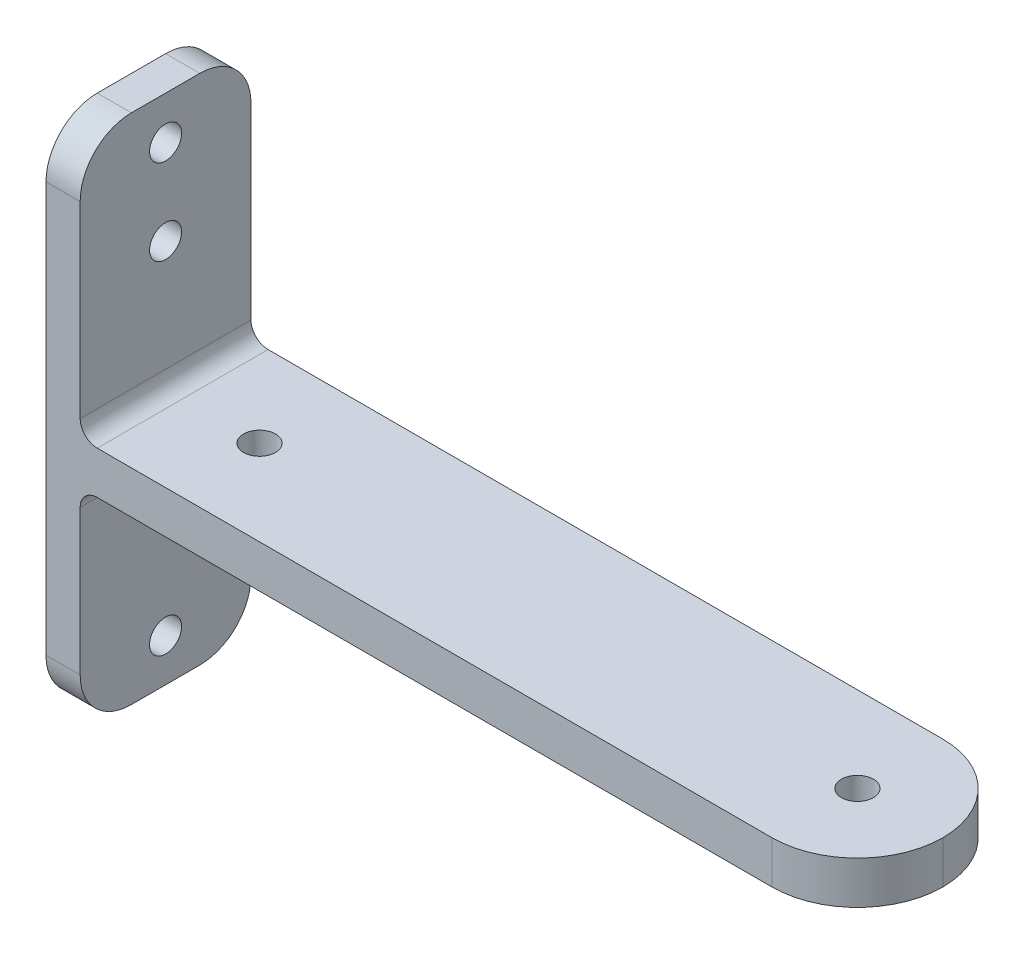
ISO-10303-21;
HEADER;
FILE_DESCRIPTION(('STEP AP214'),'2;1');
FILE_NAME('part.step','',(''),(''),'','','');
FILE_SCHEMA(('AUTOMOTIVE_DESIGN { 1 0 10303 214 1 1 1 1 }'));
ENDSEC;
DATA;
#1=APPLICATION_CONTEXT('core data for automotive mechanical design processes');
#2=APPLICATION_PROTOCOL_DEFINITION('international standard','automotive_design',2000,#1);
#3=PRODUCT_CONTEXT('',#1,'mechanical');
#4=PRODUCT('Part','Part','',(#3));
#5=PRODUCT_RELATED_PRODUCT_CATEGORY('part','',(#4));
#6=PRODUCT_DEFINITION_FORMATION('','',#4);
#7=PRODUCT_DEFINITION_CONTEXT('part definition',#1,'design');
#8=PRODUCT_DEFINITION('design','',#6,#7);
#9=PRODUCT_DEFINITION_SHAPE('','',#8);
#10=(LENGTH_UNIT() NAMED_UNIT(*) SI_UNIT(.MILLI.,.METRE.));
#11=(NAMED_UNIT(*) PLANE_ANGLE_UNIT() SI_UNIT($,.RADIAN.));
#12=(NAMED_UNIT(*) SI_UNIT($,.STERADIAN.) SOLID_ANGLE_UNIT());
#13=UNCERTAINTY_MEASURE_WITH_UNIT(LENGTH_MEASURE(1.E-05),#10,'distance_accuracy_value','');
#14=(GEOMETRIC_REPRESENTATION_CONTEXT(3) GLOBAL_UNCERTAINTY_ASSIGNED_CONTEXT((#13)) GLOBAL_UNIT_ASSIGNED_CONTEXT((#10,
#11,#12)) REPRESENTATION_CONTEXT('',''));
#15=CARTESIAN_POINT('',(0.,0.,0.));
#16=DIRECTION('',(0.,0.,1.));
#17=DIRECTION('',(1.,0.,0.));
#18=AXIS2_PLACEMENT_3D('',#15,#16,#17);
#19=CARTESIAN_POINT('',(0.,6.35,0.));
#20=DIRECTION('',(0.,1.,0.));
#21=DIRECTION('',(0.,0.,1.));
#22=AXIS2_PLACEMENT_3D('',#19,#20,#21);
#23=PLANE('',#22);
#24=DIRECTION('',(1.,0.,0.));
#25=VECTOR('',#24,1.);
#26=CARTESIAN_POINT('',(-60.325,6.35,12.7));
#27=LINE('',#26,#25);
#28=CARTESIAN_POINT('',(-52.705,6.35,12.7));
#29=VERTEX_POINT('',#28);
#30=CARTESIAN_POINT('',(47.6249999999999,6.35,12.7));
#31=VERTEX_POINT('',#30);
#32=EDGE_CURVE('E234',#29,#31,#27,.T.);
#33=ORIENTED_EDGE('',*,*,#32,.T.);
#34=CARTESIAN_POINT('',(47.625,6.35,0.));
#35=DIRECTION('',(0.,1.,0.));
#36=DIRECTION('',(0.,0.,1.));
#37=AXIS2_PLACEMENT_3D('',#34,#35,#36);
#38=CIRCLE('',#37,12.7);
#39=CARTESIAN_POINT('',(60.325,6.35,0.));
#40=VERTEX_POINT('',#39);
#41=EDGE_CURVE('E46',#31,#40,#38,.T.);
#42=ORIENTED_EDGE('',*,*,#41,.T.);
#43=CARTESIAN_POINT('',(47.625,6.35,0.));
#44=DIRECTION('',(0.,1.,0.));
#45=DIRECTION('',(0.,0.,1.));
#46=AXIS2_PLACEMENT_3D('',#43,#44,#45);
#47=CIRCLE('',#46,12.7);
#48=CARTESIAN_POINT('',(47.6249999999999,6.35,-12.7));
#49=VERTEX_POINT('',#48);
#50=EDGE_CURVE('E56',#40,#49,#47,.T.);
#51=ORIENTED_EDGE('',*,*,#50,.T.);
#52=DIRECTION('',(-1.,0.,0.));
#53=VECTOR('',#52,1.);
#54=CARTESIAN_POINT('',(-60.325,6.35,-12.7));
#55=LINE('',#54,#53);
#56=CARTESIAN_POINT('',(-52.705,6.35,-12.7));
#57=VERTEX_POINT('',#56);
#58=EDGE_CURVE('E165',#49,#57,#55,.T.);
#59=ORIENTED_EDGE('',*,*,#58,.T.);
#60=DIRECTION('',(0.,0.,-1.));
#61=VECTOR('',#60,1.);
#62=CARTESIAN_POINT('',(-52.705,6.35,12.7));
#63=LINE('',#62,#61);
#64=EDGE_CURVE('E185',#57,#29,#63,.F.);
#65=ORIENTED_EDGE('',*,*,#64,.T.);
#66=EDGE_LOOP('',(#33,#42,#51,#59,#65));
#67=FACE_BOUND('',#66,.T.);
#68=CARTESIAN_POINT('',(-41.275,6.35,0.));
#69=DIRECTION('',(0.,1.,0.));
#70=DIRECTION('',(0.,0.,1.));
#71=AXIS2_PLACEMENT_3D('',#68,#69,#70);
#72=CIRCLE('',#71,2.38125);
#73=CARTESIAN_POINT('',(-41.275,6.35,2.38125));
#74=VERTEX_POINT('',#73);
#75=EDGE_CURVE('E278',#74,#74,#72,.T.);
#76=ORIENTED_EDGE('',*,*,#75,.F.);
#77=EDGE_LOOP('',(#76));
#78=FACE_BOUND('',#77,.T.);
#79=CARTESIAN_POINT('',(47.625,6.35,0.));
#80=DIRECTION('',(0.,1.,0.));
#81=DIRECTION('',(0.,0.,1.));
#82=AXIS2_PLACEMENT_3D('',#79,#80,#81);
#83=CIRCLE('',#82,2.38125);
#84=CARTESIAN_POINT('',(47.625,6.35,2.38125));
#85=VERTEX_POINT('',#84);
#86=EDGE_CURVE('E245',#85,#85,#83,.T.);
#87=ORIENTED_EDGE('',*,*,#86,.F.);
#88=EDGE_LOOP('',(#87));
#89=FACE_BOUND('',#88,.T.);
#90=ADVANCED_FACE('F37',(#67,#78,#89),#23,.T.);
#91=CARTESIAN_POINT('',(0.,0.,0.));
#92=DIRECTION('',(0.,1.,0.));
#93=DIRECTION('',(0.,0.,1.));
#94=AXIS2_PLACEMENT_3D('',#91,#92,#93);
#95=PLANE('',#94);
#96=CARTESIAN_POINT('',(-41.275,0.,0.));
#97=DIRECTION('',(0.,1.,0.));
#98=DIRECTION('',(0.,0.,1.));
#99=AXIS2_PLACEMENT_3D('',#96,#97,#98);
#100=CIRCLE('',#99,2.38125);
#101=CARTESIAN_POINT('',(-41.275,0.,2.38125));
#102=VERTEX_POINT('',#101);
#103=EDGE_CURVE('E281',#102,#102,#100,.T.);
#104=ORIENTED_EDGE('',*,*,#103,.T.);
#105=EDGE_LOOP('',(#104));
#106=FACE_BOUND('',#105,.T.);
#107=CARTESIAN_POINT('',(47.625,0.,0.));
#108=DIRECTION('',(0.,1.,0.));
#109=DIRECTION('',(0.,0.,1.));
#110=AXIS2_PLACEMENT_3D('',#107,#108,#109);
#111=CIRCLE('',#110,12.7);
#112=CARTESIAN_POINT('',(47.6249999999999,0.,-12.7));
#113=VERTEX_POINT('',#112);
#114=CARTESIAN_POINT('',(60.325,0.,0.));
#115=VERTEX_POINT('',#114);
#116=EDGE_CURVE('E227',#113,#115,#111,.F.);
#117=ORIENTED_EDGE('',*,*,#116,.T.);
#118=CARTESIAN_POINT('',(47.625,0.,0.));
#119=DIRECTION('',(0.,1.,0.));
#120=DIRECTION('',(0.,0.,1.));
#121=AXIS2_PLACEMENT_3D('',#118,#119,#120);
#122=CIRCLE('',#121,12.7);
#123=CARTESIAN_POINT('',(47.6249999999999,0.,12.7));
#124=VERTEX_POINT('',#123);
#125=EDGE_CURVE('E164',#115,#124,#122,.F.);
#126=ORIENTED_EDGE('',*,*,#125,.T.);
#127=DIRECTION('',(1.,0.,0.));
#128=VECTOR('',#127,1.);
#129=CARTESIAN_POINT('',(-60.325,0.,12.7));
#130=LINE('',#129,#128);
#131=CARTESIAN_POINT('',(-52.705,0.,12.7));
#132=VERTEX_POINT('',#131);
#133=EDGE_CURVE('E145',#132,#124,#130,.T.);
#134=ORIENTED_EDGE('',*,*,#133,.F.);
#135=DIRECTION('',(0.,0.,-1.));
#136=VECTOR('',#135,1.);
#137=CARTESIAN_POINT('',(-52.705,0.,0.));
#138=LINE('',#137,#136);
#139=CARTESIAN_POINT('',(-52.705,0.,-12.7));
#140=VERTEX_POINT('',#139);
#141=EDGE_CURVE('E162',#132,#140,#138,.T.);
#142=ORIENTED_EDGE('',*,*,#141,.T.);
#143=DIRECTION('',(-1.,0.,0.));
#144=VECTOR('',#143,1.);
#145=CARTESIAN_POINT('',(-60.325,0.,-12.7));
#146=LINE('',#145,#144);
#147=EDGE_CURVE('E166',#113,#140,#146,.T.);
#148=ORIENTED_EDGE('',*,*,#147,.F.);
#149=EDGE_LOOP('',(#117,#126,#134,#142,#148));
#150=FACE_BOUND('',#149,.T.);
#151=CARTESIAN_POINT('',(47.625,0.,0.));
#152=DIRECTION('',(0.,1.,0.));
#153=DIRECTION('',(0.,0.,1.));
#154=AXIS2_PLACEMENT_3D('',#151,#152,#153);
#155=CIRCLE('',#154,2.38125);
#156=CARTESIAN_POINT('',(47.625,0.,2.38125));
#157=VERTEX_POINT('',#156);
#158=EDGE_CURVE('E284',#157,#157,#155,.T.);
#159=ORIENTED_EDGE('',*,*,#158,.T.);
#160=EDGE_LOOP('',(#159));
#161=FACE_BOUND('',#160,.T.);
#162=ADVANCED_FACE('F159',(#106,#150,#161),#95,.F.);
#163=CARTESIAN_POINT('',(-60.325,6.35,-12.7));
#164=DIRECTION('',(0.,0.,1.));
#165=DIRECTION('',(1.,0.,0.));
#166=AXIS2_PLACEMENT_3D('',#163,#164,#165);
#167=PLANE('',#166);
#168=ORIENTED_EDGE('',*,*,#58,.F.);
#169=DIRECTION('',(0.,-1.,0.));
#170=VECTOR('',#169,1.);
#171=CARTESIAN_POINT('',(47.625,6.35,-12.7));
#172=LINE('',#171,#170);
#173=EDGE_CURVE('E11',#49,#113,#172,.T.);
#174=ORIENTED_EDGE('',*,*,#173,.T.);
#175=ORIENTED_EDGE('',*,*,#147,.T.);
#176=CARTESIAN_POINT('',(-52.705,-2.54,-12.7));
#177=DIRECTION('',(0.,0.,1.));
#178=DIRECTION('',(1.,0.,0.));
#179=AXIS2_PLACEMENT_3D('',#176,#177,#178);
#180=CIRCLE('',#179,2.54);
#181=CARTESIAN_POINT('',(-55.245,-2.54000000000001,-12.7));
#182=VERTEX_POINT('',#181);
#183=EDGE_CURVE('E155',#140,#182,#180,.T.);
#184=ORIENTED_EDGE('',*,*,#183,.T.);
#185=DIRECTION('',(0.,1.,0.));
#186=VECTOR('',#185,1.);
#187=CARTESIAN_POINT('',(-55.245,-31.75,-12.7));
#188=LINE('',#187,#186);
#189=CARTESIAN_POINT('',(-55.245,-24.13,-12.7));
#190=VERTEX_POINT('',#189);
#191=EDGE_CURVE('E276',#190,#182,#188,.T.);
#192=ORIENTED_EDGE('',*,*,#191,.F.);
#193=DIRECTION('',(-1.,0.,0.));
#194=VECTOR('',#193,1.);
#195=CARTESIAN_POINT('',(-60.325,-24.13,-12.7));
#196=LINE('',#195,#194);
#197=CARTESIAN_POINT('',(-60.325,-24.13,-12.7));
#198=VERTEX_POINT('',#197);
#199=EDGE_CURVE('E214',#190,#198,#196,.T.);
#200=ORIENTED_EDGE('',*,*,#199,.T.);
#201=DIRECTION('',(0.,-1.,0.));
#202=VECTOR('',#201,1.);
#203=CARTESIAN_POINT('',(-60.325,6.35,-12.7));
#204=LINE('',#203,#202);
#205=CARTESIAN_POINT('',(-60.325,36.83,-12.7));
#206=VERTEX_POINT('',#205);
#207=EDGE_CURVE('E172',#206,#198,#204,.T.);
#208=ORIENTED_EDGE('',*,*,#207,.F.);
#209=DIRECTION('',(-1.,0.,0.));
#210=VECTOR('',#209,1.);
#211=CARTESIAN_POINT('',(-55.245,36.83,-12.7));
#212=LINE('',#211,#210);
#213=CARTESIAN_POINT('',(-55.245,36.83,-12.7));
#214=VERTEX_POINT('',#213);
#215=EDGE_CURVE('E212',#206,#214,#212,.F.);
#216=ORIENTED_EDGE('',*,*,#215,.T.);
#217=CARTESIAN_POINT('',(-55.245,8.88999999999999,-12.7));
#218=VERTEX_POINT('',#217);
#219=EDGE_CURVE('E279',#218,#214,#188,.T.);
#220=ORIENTED_EDGE('',*,*,#219,.F.);
#221=CARTESIAN_POINT('',(-52.705,8.89,-12.7));
#222=DIRECTION('',(0.,0.,1.));
#223=DIRECTION('',(1.,0.,0.));
#224=AXIS2_PLACEMENT_3D('',#221,#222,#223);
#225=CIRCLE('',#224,2.54);
#226=EDGE_CURVE('E154',#218,#57,#225,.T.);
#227=ORIENTED_EDGE('',*,*,#226,.T.);
#228=EDGE_LOOP('',(#168,#174,#175,#184,#192,#200,#208,#216,#220,#227));
#229=FACE_BOUND('',#228,.T.);
#230=ADVANCED_FACE('F310',(#229),#167,.F.);
#231=CARTESIAN_POINT('',(-60.325,6.35,-12.7));
#232=DIRECTION('',(1.,0.,0.));
#233=DIRECTION('',(0.,0.,-1.));
#234=AXIS2_PLACEMENT_3D('',#231,#232,#233);
#235=PLANE('',#234);
#236=CARTESIAN_POINT('',(-60.325,38.1,0.));
#237=DIRECTION('',(-1.,0.,0.));
#238=DIRECTION('',(0.,0.,1.));
#239=AXIS2_PLACEMENT_3D('',#236,#237,#238);
#240=CIRCLE('',#239,2.38125);
#241=CARTESIAN_POINT('',(-60.325,38.1,2.38125));
#242=VERTEX_POINT('',#241);
#243=EDGE_CURVE('E351',#242,#242,#240,.T.);
#244=ORIENTED_EDGE('',*,*,#243,.F.);
#245=EDGE_LOOP('',(#244));
#246=FACE_BOUND('',#245,.T.);
#247=CARTESIAN_POINT('',(-60.325,-25.4,0.));
#248=DIRECTION('',(-1.,0.,0.));
#249=DIRECTION('',(0.,0.,1.));
#250=AXIS2_PLACEMENT_3D('',#247,#248,#249);
#251=CIRCLE('',#250,2.38125);
#252=CARTESIAN_POINT('',(-60.325,-25.4,2.38125));
#253=VERTEX_POINT('',#252);
#254=EDGE_CURVE('E353',#253,#253,#251,.T.);
#255=ORIENTED_EDGE('',*,*,#254,.F.);
#256=EDGE_LOOP('',(#255));
#257=FACE_BOUND('',#256,.T.);
#258=CARTESIAN_POINT('',(-60.325,25.4,0.));
#259=DIRECTION('',(-1.,0.,0.));
#260=DIRECTION('',(0.,0.,1.));
#261=AXIS2_PLACEMENT_3D('',#258,#259,#260);
#262=CIRCLE('',#261,2.38125);
#263=CARTESIAN_POINT('',(-60.325,25.4,2.38125));
#264=VERTEX_POINT('',#263);
#265=EDGE_CURVE('E250',#264,#264,#262,.T.);
#266=ORIENTED_EDGE('',*,*,#265,.F.);
#267=EDGE_LOOP('',(#266));
#268=FACE_BOUND('',#267,.T.);
#269=DIRECTION('',(0.,0.,1.));
#270=VECTOR('',#269,1.);
#271=CARTESIAN_POINT('',(-60.325,-31.75,-12.7));
#272=LINE('',#271,#270);
#273=CARTESIAN_POINT('',(-60.325,-31.75,-5.08));
#274=VERTEX_POINT('',#273);
#275=CARTESIAN_POINT('',(-60.325,-31.75,5.08));
#276=VERTEX_POINT('',#275);
#277=EDGE_CURVE('E265',#274,#276,#272,.T.);
#278=ORIENTED_EDGE('',*,*,#277,.T.);
#279=CARTESIAN_POINT('',(-60.325,-24.13,5.08));
#280=DIRECTION('',(1.,0.,0.));
#281=DIRECTION('',(0.,0.,-1.));
#282=AXIS2_PLACEMENT_3D('',#279,#280,#281);
#283=CIRCLE('',#282,7.62);
#284=CARTESIAN_POINT('',(-60.325,-24.13,12.7));
#285=VERTEX_POINT('',#284);
#286=EDGE_CURVE('E210',#276,#285,#283,.F.);
#287=ORIENTED_EDGE('',*,*,#286,.T.);
#288=DIRECTION('',(0.,-1.,0.));
#289=VECTOR('',#288,1.);
#290=CARTESIAN_POINT('',(-60.325,6.35,12.7));
#291=LINE('',#290,#289);
#292=CARTESIAN_POINT('',(-60.325,36.83,12.7));
#293=VERTEX_POINT('',#292);
#294=EDGE_CURVE('E177',#293,#285,#291,.T.);
#295=ORIENTED_EDGE('',*,*,#294,.F.);
#296=CARTESIAN_POINT('',(-60.325,36.83,5.08));
#297=DIRECTION('',(1.,0.,0.));
#298=DIRECTION('',(0.,0.,-1.));
#299=AXIS2_PLACEMENT_3D('',#296,#297,#298);
#300=CIRCLE('',#299,7.62);
#301=CARTESIAN_POINT('',(-60.325,44.45,5.08));
#302=VERTEX_POINT('',#301);
#303=EDGE_CURVE('E206',#293,#302,#300,.F.);
#304=ORIENTED_EDGE('',*,*,#303,.T.);
#305=DIRECTION('',(0.,0.,1.));
#306=VECTOR('',#305,1.);
#307=CARTESIAN_POINT('',(-60.325,44.45,-12.7));
#308=LINE('',#307,#306);
#309=CARTESIAN_POINT('',(-60.325,44.45,-5.08));
#310=VERTEX_POINT('',#309);
#311=EDGE_CURVE('E255',#310,#302,#308,.T.);
#312=ORIENTED_EDGE('',*,*,#311,.F.);
#313=CARTESIAN_POINT('',(-60.325,36.83,-5.08));
#314=DIRECTION('',(1.,0.,0.));
#315=DIRECTION('',(0.,0.,-1.));
#316=AXIS2_PLACEMENT_3D('',#313,#314,#315);
#317=CIRCLE('',#316,7.62);
#318=EDGE_CURVE('E204',#310,#206,#317,.F.);
#319=ORIENTED_EDGE('',*,*,#318,.T.);
#320=ORIENTED_EDGE('',*,*,#207,.T.);
#321=CARTESIAN_POINT('',(-60.325,-24.13,-5.08));
#322=DIRECTION('',(1.,0.,0.));
#323=DIRECTION('',(0.,0.,-1.));
#324=AXIS2_PLACEMENT_3D('',#321,#322,#323);
#325=CIRCLE('',#324,7.62);
#326=EDGE_CURVE('E208',#198,#274,#325,.F.);
#327=ORIENTED_EDGE('',*,*,#326,.T.);
#328=EDGE_LOOP('',(#278,#287,#295,#304,#312,#319,#320,#327));
#329=FACE_BOUND('',#328,.T.);
#330=ADVANCED_FACE('F303',(#246,#257,#268,#329),#235,.F.);
#331=CARTESIAN_POINT('',(-60.325,6.35,12.7));
#332=DIRECTION('',(0.,0.,-1.));
#333=DIRECTION('',(-1.,0.,0.));
#334=AXIS2_PLACEMENT_3D('',#331,#332,#333);
#335=PLANE('',#334);
#336=ORIENTED_EDGE('',*,*,#133,.T.);
#337=DIRECTION('',(0.,-1.,0.));
#338=VECTOR('',#337,1.);
#339=CARTESIAN_POINT('',(47.625,6.35,12.7));
#340=LINE('',#339,#338);
#341=EDGE_CURVE('E230',#124,#31,#340,.F.);
#342=ORIENTED_EDGE('',*,*,#341,.T.);
#343=ORIENTED_EDGE('',*,*,#32,.F.);
#344=CARTESIAN_POINT('',(-52.705,8.89,12.7));
#345=DIRECTION('',(0.,0.,-1.));
#346=DIRECTION('',(-1.,0.,0.));
#347=AXIS2_PLACEMENT_3D('',#344,#345,#346);
#348=CIRCLE('',#347,2.54);
#349=CARTESIAN_POINT('',(-55.245,8.88999999999999,12.7));
#350=VERTEX_POINT('',#349);
#351=EDGE_CURVE('E190',#29,#350,#348,.T.);
#352=ORIENTED_EDGE('',*,*,#351,.T.);
#353=DIRECTION('',(0.,1.,0.));
#354=VECTOR('',#353,1.);
#355=CARTESIAN_POINT('',(-55.245,-31.75,12.7));
#356=LINE('',#355,#354);
#357=CARTESIAN_POINT('',(-55.245,36.83,12.7));
#358=VERTEX_POINT('',#357);
#359=EDGE_CURVE('E275',#350,#358,#356,.T.);
#360=ORIENTED_EDGE('',*,*,#359,.T.);
#361=DIRECTION('',(1.,0.,0.));
#362=VECTOR('',#361,1.);
#363=CARTESIAN_POINT('',(-60.325,36.83,12.7));
#364=LINE('',#363,#362);
#365=EDGE_CURVE('E192',#358,#293,#364,.F.);
#366=ORIENTED_EDGE('',*,*,#365,.T.);
#367=ORIENTED_EDGE('',*,*,#294,.T.);
#368=DIRECTION('',(1.,0.,0.));
#369=VECTOR('',#368,1.);
#370=CARTESIAN_POINT('',(-60.325,-24.13,12.7));
#371=LINE('',#370,#369);
#372=CARTESIAN_POINT('',(-55.245,-24.13,12.7));
#373=VERTEX_POINT('',#372);
#374=EDGE_CURVE('E194',#285,#373,#371,.T.);
#375=ORIENTED_EDGE('',*,*,#374,.T.);
#376=CARTESIAN_POINT('',(-55.245,-2.54000000000001,12.7));
#377=VERTEX_POINT('',#376);
#378=EDGE_CURVE('E149',#373,#377,#356,.T.);
#379=ORIENTED_EDGE('',*,*,#378,.T.);
#380=CARTESIAN_POINT('',(-52.705,-2.54,12.7));
#381=DIRECTION('',(0.,0.,-1.));
#382=DIRECTION('',(-1.,0.,0.));
#383=AXIS2_PLACEMENT_3D('',#380,#381,#382);
#384=CIRCLE('',#383,2.54);
#385=EDGE_CURVE('E141',#377,#132,#384,.T.);
#386=ORIENTED_EDGE('',*,*,#385,.T.);
#387=EDGE_LOOP('',(#336,#342,#343,#352,#360,#366,#367,#375,#379,#386));
#388=FACE_BOUND('',#387,.T.);
#389=ADVANCED_FACE('F143',(#388),#335,.F.);
#390=CARTESIAN_POINT('',(47.625,6.35,0.));
#391=DIRECTION('',(0.,-1.,0.));
#392=DIRECTION('',(0.,0.,-1.));
#393=AXIS2_PLACEMENT_3D('',#390,#391,#392);
#394=CYLINDRICAL_SURFACE('',#393,2.38125);
#395=ORIENTED_EDGE('',*,*,#86,.T.);
#396=EDGE_LOOP('',(#395));
#397=FACE_BOUND('',#396,.T.);
#398=ORIENTED_EDGE('',*,*,#158,.F.);
#399=EDGE_LOOP('',(#398));
#400=FACE_BOUND('',#399,.T.);
#401=ADVANCED_FACE('F291',(#397,#400),#394,.F.);
#402=CARTESIAN_POINT('',(-41.275,0.,0.));
#403=DIRECTION('',(0.,1.,0.));
#404=DIRECTION('',(0.,0.,1.));
#405=AXIS2_PLACEMENT_3D('',#402,#403,#404);
#406=CYLINDRICAL_SURFACE('',#405,2.38125);
#407=ORIENTED_EDGE('',*,*,#103,.F.);
#408=EDGE_LOOP('',(#407));
#409=FACE_BOUND('',#408,.T.);
#410=ORIENTED_EDGE('',*,*,#75,.T.);
#411=EDGE_LOOP('',(#410));
#412=FACE_BOUND('',#411,.T.);
#413=ADVANCED_FACE('F293',(#409,#412),#406,.F.);
#414=CARTESIAN_POINT('',(0.,-31.75,0.));
#415=DIRECTION('',(0.,1.,0.));
#416=DIRECTION('',(0.,0.,1.));
#417=AXIS2_PLACEMENT_3D('',#414,#415,#416);
#418=PLANE('',#417);
#419=DIRECTION('',(0.,0.,-1.));
#420=VECTOR('',#419,1.);
#421=CARTESIAN_POINT('',(-55.245,-31.75,-12.7));
#422=LINE('',#421,#420);
#423=CARTESIAN_POINT('',(-55.245,-31.75,5.08));
#424=VERTEX_POINT('',#423);
#425=CARTESIAN_POINT('',(-55.245,-31.75,-5.08));
#426=VERTEX_POINT('',#425);
#427=EDGE_CURVE('E272',#424,#426,#422,.T.);
#428=ORIENTED_EDGE('',*,*,#427,.F.);
#429=DIRECTION('',(1.,0.,0.));
#430=VECTOR('',#429,1.);
#431=CARTESIAN_POINT('',(0.,-31.75,5.08));
#432=LINE('',#431,#430);
#433=EDGE_CURVE('E202',#424,#276,#432,.F.);
#434=ORIENTED_EDGE('',*,*,#433,.T.);
#435=ORIENTED_EDGE('',*,*,#277,.F.);
#436=DIRECTION('',(-1.,0.,0.));
#437=VECTOR('',#436,1.);
#438=CARTESIAN_POINT('',(0.,-31.75,-5.08));
#439=LINE('',#438,#437);
#440=EDGE_CURVE('E200',#274,#426,#439,.F.);
#441=ORIENTED_EDGE('',*,*,#440,.T.);
#442=EDGE_LOOP('',(#428,#434,#435,#441));
#443=FACE_BOUND('',#442,.T.);
#444=ADVANCED_FACE('F300',(#443),#418,.F.);
#445=CARTESIAN_POINT('',(-55.245,-31.75,-12.7));
#446=DIRECTION('',(1.,0.,0.));
#447=DIRECTION('',(0.,0.,-1.));
#448=AXIS2_PLACEMENT_3D('',#445,#446,#447);
#449=PLANE('',#448);
#450=CARTESIAN_POINT('',(-55.245,-25.4,0.));
#451=DIRECTION('',(1.,0.,0.));
#452=DIRECTION('',(0.,0.,-1.));
#453=AXIS2_PLACEMENT_3D('',#450,#451,#452);
#454=CIRCLE('',#453,2.38125);
#455=CARTESIAN_POINT('',(-55.245,-25.4,2.38125));
#456=VERTEX_POINT('',#455);
#457=EDGE_CURVE('E180',#456,#456,#454,.T.);
#458=ORIENTED_EDGE('',*,*,#457,.F.);
#459=EDGE_LOOP('',(#458));
#460=FACE_BOUND('',#459,.T.);
#461=ORIENTED_EDGE('',*,*,#378,.F.);
#462=CARTESIAN_POINT('',(-55.245,-24.13,5.08));
#463=DIRECTION('',(1.,0.,0.));
#464=DIRECTION('',(0.,0.,-1.));
#465=AXIS2_PLACEMENT_3D('',#462,#463,#464);
#466=CIRCLE('',#465,7.62);
#467=EDGE_CURVE('E198',#373,#424,#466,.T.);
#468=ORIENTED_EDGE('',*,*,#467,.T.);
#469=ORIENTED_EDGE('',*,*,#427,.T.);
#470=CARTESIAN_POINT('',(-55.245,-24.13,-5.08));
#471=DIRECTION('',(1.,0.,0.));
#472=DIRECTION('',(0.,0.,-1.));
#473=AXIS2_PLACEMENT_3D('',#470,#471,#472);
#474=CIRCLE('',#473,7.62);
#475=EDGE_CURVE('E196',#426,#190,#474,.T.);
#476=ORIENTED_EDGE('',*,*,#475,.T.);
#477=ORIENTED_EDGE('',*,*,#191,.T.);
#478=DIRECTION('',(0.,0.,-1.));
#479=VECTOR('',#478,1.);
#480=CARTESIAN_POINT('',(-55.245,-2.54,-12.7));
#481=LINE('',#480,#479);
#482=EDGE_CURVE('E171',#182,#377,#481,.F.);
#483=ORIENTED_EDGE('',*,*,#482,.T.);
#484=EDGE_LOOP('',(#461,#468,#469,#476,#477,#483));
#485=FACE_BOUND('',#484,.T.);
#486=ADVANCED_FACE('F374',(#460,#485),#449,.T.);
#487=CARTESIAN_POINT('',(-55.245,38.1,0.));
#488=DIRECTION('',(1.,0.,0.));
#489=DIRECTION('',(0.,0.,-1.));
#490=AXIS2_PLACEMENT_3D('',#487,#488,#489);
#491=CIRCLE('',#490,2.38125);
#492=CARTESIAN_POINT('',(-55.245,38.1,2.38125));
#493=VERTEX_POINT('',#492);
#494=EDGE_CURVE('E249',#493,#493,#491,.T.);
#495=ORIENTED_EDGE('',*,*,#494,.F.);
#496=EDGE_LOOP('',(#495));
#497=FACE_BOUND('',#496,.T.);
#498=CARTESIAN_POINT('',(-55.245,25.4,0.));
#499=DIRECTION('',(1.,0.,0.));
#500=DIRECTION('',(0.,0.,-1.));
#501=AXIS2_PLACEMENT_3D('',#498,#499,#500);
#502=CIRCLE('',#501,2.38125);
#503=CARTESIAN_POINT('',(-55.245,25.4,2.38125));
#504=VERTEX_POINT('',#503);
#505=EDGE_CURVE('E247',#504,#504,#502,.T.);
#506=ORIENTED_EDGE('',*,*,#505,.F.);
#507=EDGE_LOOP('',(#506));
#508=FACE_BOUND('',#507,.T.);
#509=DIRECTION('',(0.,0.,-1.));
#510=VECTOR('',#509,1.);
#511=CARTESIAN_POINT('',(-55.245,44.45,-12.7));
#512=LINE('',#511,#510);
#513=CARTESIAN_POINT('',(-55.245,44.45,5.08));
#514=VERTEX_POINT('',#513);
#515=CARTESIAN_POINT('',(-55.245,44.45,-5.08));
#516=VERTEX_POINT('',#515);
#517=EDGE_CURVE('E259',#514,#516,#512,.T.);
#518=ORIENTED_EDGE('',*,*,#517,.F.);
#519=CARTESIAN_POINT('',(-55.245,36.83,5.08));
#520=DIRECTION('',(1.,0.,0.));
#521=DIRECTION('',(0.,0.,-1.));
#522=AXIS2_PLACEMENT_3D('',#519,#520,#521);
#523=CIRCLE('',#522,7.62);
#524=EDGE_CURVE('E225',#514,#358,#523,.T.);
#525=ORIENTED_EDGE('',*,*,#524,.T.);
#526=ORIENTED_EDGE('',*,*,#359,.F.);
#527=DIRECTION('',(0.,0.,-1.));
#528=VECTOR('',#527,1.);
#529=CARTESIAN_POINT('',(-55.245,8.89,-12.7));
#530=LINE('',#529,#528);
#531=EDGE_CURVE('E174',#350,#218,#530,.T.);
#532=ORIENTED_EDGE('',*,*,#531,.T.);
#533=ORIENTED_EDGE('',*,*,#219,.T.);
#534=CARTESIAN_POINT('',(-55.245,36.83,-5.08));
#535=DIRECTION('',(1.,0.,0.));
#536=DIRECTION('',(0.,0.,-1.));
#537=AXIS2_PLACEMENT_3D('',#534,#535,#536);
#538=CIRCLE('',#537,7.62);
#539=EDGE_CURVE('E223',#214,#516,#538,.T.);
#540=ORIENTED_EDGE('',*,*,#539,.T.);
#541=EDGE_LOOP('',(#518,#525,#526,#532,#533,#540));
#542=FACE_BOUND('',#541,.T.);
#543=ADVANCED_FACE('F388',(#497,#508,#542),#449,.T.);
#544=CARTESIAN_POINT('',(0.,44.45,0.));
#545=DIRECTION('',(0.,1.,0.));
#546=DIRECTION('',(0.,0.,1.));
#547=AXIS2_PLACEMENT_3D('',#544,#545,#546);
#548=PLANE('',#547);
#549=ORIENTED_EDGE('',*,*,#311,.T.);
#550=DIRECTION('',(1.,0.,0.));
#551=VECTOR('',#550,1.);
#552=CARTESIAN_POINT('',(-55.245,44.45,5.08));
#553=LINE('',#552,#551);
#554=EDGE_CURVE('E220',#302,#514,#553,.T.);
#555=ORIENTED_EDGE('',*,*,#554,.T.);
#556=ORIENTED_EDGE('',*,*,#517,.T.);
#557=DIRECTION('',(-1.,0.,0.));
#558=VECTOR('',#557,1.);
#559=CARTESIAN_POINT('',(-60.325,44.45,-5.08));
#560=LINE('',#559,#558);
#561=EDGE_CURVE('E217',#516,#310,#560,.T.);
#562=ORIENTED_EDGE('',*,*,#561,.T.);
#563=EDGE_LOOP('',(#549,#555,#556,#562));
#564=FACE_BOUND('',#563,.T.);
#565=ADVANCED_FACE('F390',(#564),#548,.T.);
#566=CARTESIAN_POINT('',(60.325,25.4,0.));
#567=DIRECTION('',(-1.,0.,0.));
#568=DIRECTION('',(0.,0.,1.));
#569=AXIS2_PLACEMENT_3D('',#566,#567,#568);
#570=CYLINDRICAL_SURFACE('',#569,2.38125);
#571=CARTESIAN_POINT('',(-55.245,25.4,2.38125));
#572=CARTESIAN_POINT('',(-55.2979166666667,25.4,2.38125));
#573=CARTESIAN_POINT('',(-55.3508333333333,25.4,2.38125));
#574=CARTESIAN_POINT('',(-55.4566666666667,25.4,2.38125));
#575=CARTESIAN_POINT('',(-55.5095833333333,25.4,2.38125));
#576=CARTESIAN_POINT('',(-55.6154166666667,25.4,2.38125));
#577=CARTESIAN_POINT('',(-55.6683333333334,25.4,2.38125));
#578=CARTESIAN_POINT('',(-55.7741666666667,25.4,2.38125));
#579=CARTESIAN_POINT('',(-55.8270833333333,25.4,2.38125));
#580=CARTESIAN_POINT('',(-55.9329166666667,25.4,2.38125));
#581=CARTESIAN_POINT('',(-55.9858333333333,25.4,2.38125));
#582=CARTESIAN_POINT('',(-56.0916666666667,25.4,2.38125));
#583=CARTESIAN_POINT('',(-56.1445833333333,25.4,2.38125));
#584=CARTESIAN_POINT('',(-56.2504166666667,25.4,2.38125));
#585=CARTESIAN_POINT('',(-56.3033333333333,25.4,2.38125));
#586=CARTESIAN_POINT('',(-56.4091666666667,25.4,2.38125));
#587=CARTESIAN_POINT('',(-56.4620833333333,25.4,2.38125));
#588=CARTESIAN_POINT('',(-56.5679166666667,25.4,2.38125));
#589=CARTESIAN_POINT('',(-56.6208333333334,25.4,2.38125));
#590=CARTESIAN_POINT('',(-56.7266666666667,25.4,2.38125));
#591=CARTESIAN_POINT('',(-56.7795833333334,25.4,2.38125));
#592=CARTESIAN_POINT('',(-56.8854166666667,25.4,2.38125));
#593=CARTESIAN_POINT('',(-56.9383333333334,25.4,2.38125));
#594=CARTESIAN_POINT('',(-57.0441666666667,25.4,2.38125));
#595=CARTESIAN_POINT('',(-57.0970833333334,25.4,2.38125));
#596=CARTESIAN_POINT('',(-57.2029166666667,25.4,2.38125));
#597=CARTESIAN_POINT('',(-57.2558333333334,25.4,2.38125));
#598=CARTESIAN_POINT('',(-57.3616666666667,25.4,2.38125));
#599=CARTESIAN_POINT('',(-57.4145833333334,25.4,2.38125));
#600=CARTESIAN_POINT('',(-57.5204166666667,25.4,2.38125));
#601=CARTESIAN_POINT('',(-57.5733333333334,25.4,2.38125));
#602=CARTESIAN_POINT('',(-57.6791666666667,25.4,2.38125));
#603=CARTESIAN_POINT('',(-57.7320833333333,25.4,2.38125));
#604=CARTESIAN_POINT('',(-57.8379166666667,25.4,2.38125));
#605=CARTESIAN_POINT('',(-57.8908333333333,25.4,2.38125));
#606=CARTESIAN_POINT('',(-57.9966666666667,25.4,2.38125));
#607=CARTESIAN_POINT('',(-58.0495833333334,25.4,2.38125));
#608=CARTESIAN_POINT('',(-58.1554166666667,25.4,2.38125));
#609=CARTESIAN_POINT('',(-58.2083333333333,25.4,2.38125));
#610=CARTESIAN_POINT('',(-58.3141666666667,25.4,2.38125));
#611=CARTESIAN_POINT('',(-58.3670833333333,25.4,2.38125));
#612=CARTESIAN_POINT('',(-58.4729166666667,25.4,2.38125));
#613=CARTESIAN_POINT('',(-58.5258333333333,25.4,2.38125));
#614=CARTESIAN_POINT('',(-58.6316666666667,25.4,2.38125));
#615=CARTESIAN_POINT('',(-58.6845833333333,25.4,2.38125));
#616=CARTESIAN_POINT('',(-58.7904166666667,25.4,2.38125));
#617=CARTESIAN_POINT('',(-58.8433333333333,25.4,2.38125));
#618=CARTESIAN_POINT('',(-58.9491666666667,25.4,2.38125));
#619=CARTESIAN_POINT('',(-59.0020833333334,25.4,2.38125));
#620=CARTESIAN_POINT('',(-59.1079166666667,25.4,2.38125));
#621=CARTESIAN_POINT('',(-59.1608333333334,25.4,2.38125));
#622=CARTESIAN_POINT('',(-59.2666666666667,25.4,2.38125));
#623=CARTESIAN_POINT('',(-59.3195833333334,25.4,2.38125));
#624=CARTESIAN_POINT('',(-59.4254166666667,25.4,2.38125));
#625=CARTESIAN_POINT('',(-59.4783333333334,25.4,2.38125));
#626=CARTESIAN_POINT('',(-59.5841666666667,25.4,2.38125));
#627=CARTESIAN_POINT('',(-59.6370833333334,25.4,2.38125));
#628=CARTESIAN_POINT('',(-59.7429166666667,25.4,2.38125));
#629=CARTESIAN_POINT('',(-59.7958333333334,25.4,2.38125));
#630=CARTESIAN_POINT('',(-59.9016666666667,25.4,2.38125));
#631=CARTESIAN_POINT('',(-59.9545833333334,25.4,2.38125));
#632=CARTESIAN_POINT('',(-60.0604166666667,25.4,2.38125));
#633=CARTESIAN_POINT('',(-60.1133333333334,25.4,2.38125));
#634=CARTESIAN_POINT('',(-60.2191666666667,25.4,2.38125));
#635=CARTESIAN_POINT('',(-60.2720833333333,25.4,2.38125));
#636=CARTESIAN_POINT('',(-60.325,25.4,2.38125));
#637=B_SPLINE_CURVE_WITH_KNOTS('',3,(#571,#572,#573,#574,#575,#576,#577,#578,#579,#580,#581,
#582,#583,#584,#585,#586,#587,#588,#589,#590,#591,#592,#593,#594,#595,#596,#597,#598,#599,#600,
#601,#602,#603,#604,#605,#606,#607,#608,#609,#610,#611,#612,#613,#614,#615,#616,#617,#618,#619,
#620,#621,#622,#623,#624,#625,#626,#627,#628,#629,#630,#631,#632,#633,#634,#635,#636),
.UNSPECIFIED.,.F.,.F.,(4,2,2,2,2,2,2,2,2,2,2,2,2,2,2,2,2,2,2,2,2,2,2,2,2,2,2,2,2,2,2,2,4),(0.,
0.158749999999999,0.317499999999998,0.476249999999998,0.634999999999997,0.793749999999996,
0.952499999999995,1.11124999999999,1.26999999999999,1.42875000000001,1.58750000000001,1.74625,
1.905,2.06375,2.2225,2.38125,2.54,2.69875,2.8575,3.01625,3.175,3.33375,3.4925,3.65124999999999,
3.81000000000001,3.96875000000001,4.12750000000001,4.28625000000001,4.445,4.60375,4.7625,
4.92125,5.08),.UNSPECIFIED.);
#638=EDGE_CURVE('BSEAM363',#504,#264,#637,.T.);
#639=ORIENTED_EDGE('',*,*,#505,.T.);
#640=ORIENTED_EDGE('',*,*,#265,.T.);
#641=ORIENTED_EDGE('',*,*,#638,.T.);
#642=ORIENTED_EDGE('',*,*,#638,.F.);
#643=EDGE_LOOP('',(#639,#641,#640,#642));
#644=FACE_BOUND('',#643,.T.);
#645=ADVANCED_FACE('F363',(#644),#570,.F.);
#646=CARTESIAN_POINT('',(60.325,38.1,0.));
#647=DIRECTION('',(-1.,0.,0.));
#648=DIRECTION('',(0.,0.,1.));
#649=AXIS2_PLACEMENT_3D('',#646,#647,#648);
#650=CYLINDRICAL_SURFACE('',#649,2.38125);
#651=CARTESIAN_POINT('',(-55.245,38.1,2.38125));
#652=CARTESIAN_POINT('',(-55.2979166666667,38.1,2.38125));
#653=CARTESIAN_POINT('',(-55.3508333333333,38.1,2.38125));
#654=CARTESIAN_POINT('',(-55.4566666666667,38.1,2.38125));
#655=CARTESIAN_POINT('',(-55.5095833333333,38.1,2.38125));
#656=CARTESIAN_POINT('',(-55.6154166666667,38.1,2.38125));
#657=CARTESIAN_POINT('',(-55.6683333333334,38.1,2.38125));
#658=CARTESIAN_POINT('',(-55.7741666666667,38.1,2.38125));
#659=CARTESIAN_POINT('',(-55.8270833333333,38.1,2.38125));
#660=CARTESIAN_POINT('',(-55.9329166666667,38.1,2.38125));
#661=CARTESIAN_POINT('',(-55.9858333333333,38.1,2.38125));
#662=CARTESIAN_POINT('',(-56.0916666666667,38.1,2.38125));
#663=CARTESIAN_POINT('',(-56.1445833333333,38.1,2.38125));
#664=CARTESIAN_POINT('',(-56.2504166666667,38.1,2.38125));
#665=CARTESIAN_POINT('',(-56.3033333333333,38.1,2.38125));
#666=CARTESIAN_POINT('',(-56.4091666666667,38.1,2.38125));
#667=CARTESIAN_POINT('',(-56.4620833333333,38.1,2.38125));
#668=CARTESIAN_POINT('',(-56.5679166666667,38.1,2.38125));
#669=CARTESIAN_POINT('',(-56.6208333333334,38.1,2.38125));
#670=CARTESIAN_POINT('',(-56.7266666666667,38.1,2.38125));
#671=CARTESIAN_POINT('',(-56.7795833333334,38.1,2.38125));
#672=CARTESIAN_POINT('',(-56.8854166666667,38.1,2.38125));
#673=CARTESIAN_POINT('',(-56.9383333333334,38.1,2.38125));
#674=CARTESIAN_POINT('',(-57.0441666666667,38.1,2.38125));
#675=CARTESIAN_POINT('',(-57.0970833333334,38.1,2.38125));
#676=CARTESIAN_POINT('',(-57.2029166666667,38.1,2.38125));
#677=CARTESIAN_POINT('',(-57.2558333333334,38.1,2.38125));
#678=CARTESIAN_POINT('',(-57.3616666666667,38.1,2.38125));
#679=CARTESIAN_POINT('',(-57.4145833333334,38.1,2.38125));
#680=CARTESIAN_POINT('',(-57.5204166666667,38.1,2.38125));
#681=CARTESIAN_POINT('',(-57.5733333333334,38.1,2.38125));
#682=CARTESIAN_POINT('',(-57.6791666666667,38.1,2.38125));
#683=CARTESIAN_POINT('',(-57.7320833333333,38.1,2.38125));
#684=CARTESIAN_POINT('',(-57.8379166666667,38.1,2.38125));
#685=CARTESIAN_POINT('',(-57.8908333333333,38.1,2.38125));
#686=CARTESIAN_POINT('',(-57.9966666666667,38.1,2.38125));
#687=CARTESIAN_POINT('',(-58.0495833333334,38.1,2.38125));
#688=CARTESIAN_POINT('',(-58.1554166666667,38.1,2.38125));
#689=CARTESIAN_POINT('',(-58.2083333333333,38.1,2.38125));
#690=CARTESIAN_POINT('',(-58.3141666666667,38.1,2.38125));
#691=CARTESIAN_POINT('',(-58.3670833333333,38.1,2.38125));
#692=CARTESIAN_POINT('',(-58.4729166666667,38.1,2.38125));
#693=CARTESIAN_POINT('',(-58.5258333333333,38.1,2.38125));
#694=CARTESIAN_POINT('',(-58.6316666666667,38.1,2.38125));
#695=CARTESIAN_POINT('',(-58.6845833333333,38.1,2.38125));
#696=CARTESIAN_POINT('',(-58.7904166666667,38.1,2.38125));
#697=CARTESIAN_POINT('',(-58.8433333333333,38.1,2.38125));
#698=CARTESIAN_POINT('',(-58.9491666666667,38.1,2.38125));
#699=CARTESIAN_POINT('',(-59.0020833333334,38.1,2.38125));
#700=CARTESIAN_POINT('',(-59.1079166666667,38.1,2.38125));
#701=CARTESIAN_POINT('',(-59.1608333333334,38.1,2.38125));
#702=CARTESIAN_POINT('',(-59.2666666666667,38.1,2.38125));
#703=CARTESIAN_POINT('',(-59.3195833333334,38.1,2.38125));
#704=CARTESIAN_POINT('',(-59.4254166666667,38.1,2.38125));
#705=CARTESIAN_POINT('',(-59.4783333333334,38.1,2.38125));
#706=CARTESIAN_POINT('',(-59.5841666666667,38.1,2.38125));
#707=CARTESIAN_POINT('',(-59.6370833333334,38.1,2.38125));
#708=CARTESIAN_POINT('',(-59.7429166666667,38.1,2.38125));
#709=CARTESIAN_POINT('',(-59.7958333333334,38.1,2.38125));
#710=CARTESIAN_POINT('',(-59.9016666666667,38.1,2.38125));
#711=CARTESIAN_POINT('',(-59.9545833333334,38.1,2.38125));
#712=CARTESIAN_POINT('',(-60.0604166666667,38.1,2.38125));
#713=CARTESIAN_POINT('',(-60.1133333333334,38.1,2.38125));
#714=CARTESIAN_POINT('',(-60.2191666666667,38.1,2.38125));
#715=CARTESIAN_POINT('',(-60.2720833333333,38.1,2.38125));
#716=CARTESIAN_POINT('',(-60.325,38.1,2.38125));
#717=B_SPLINE_CURVE_WITH_KNOTS('',3,(#651,#652,#653,#654,#655,#656,#657,#658,#659,#660,#661,
#662,#663,#664,#665,#666,#667,#668,#669,#670,#671,#672,#673,#674,#675,#676,#677,#678,#679,#680,
#681,#682,#683,#684,#685,#686,#687,#688,#689,#690,#691,#692,#693,#694,#695,#696,#697,#698,#699,
#700,#701,#702,#703,#704,#705,#706,#707,#708,#709,#710,#711,#712,#713,#714,#715,#716),
.UNSPECIFIED.,.F.,.F.,(4,2,2,2,2,2,2,2,2,2,2,2,2,2,2,2,2,2,2,2,2,2,2,2,2,2,2,2,2,2,2,2,4),(0.,
0.158749999999999,0.317499999999998,0.476249999999998,0.634999999999997,0.793749999999996,
0.952499999999995,1.11124999999999,1.26999999999999,1.42875000000001,1.58750000000001,1.74625,
1.905,2.06375,2.2225,2.38125,2.54,2.69875,2.8575,3.01625,3.175,3.33375,3.4925,3.65124999999999,
3.81000000000001,3.96875000000001,4.12750000000001,4.28625000000001,4.445,4.60375,4.7625,
4.92125,5.08),.UNSPECIFIED.);
#718=EDGE_CURVE('BSEAM413',#493,#242,#717,.T.);
#719=ORIENTED_EDGE('',*,*,#494,.T.);
#720=ORIENTED_EDGE('',*,*,#243,.T.);
#721=ORIENTED_EDGE('',*,*,#718,.T.);
#722=ORIENTED_EDGE('',*,*,#718,.F.);
#723=EDGE_LOOP('',(#719,#721,#720,#722));
#724=FACE_BOUND('',#723,.T.);
#725=ADVANCED_FACE('F413',(#724),#650,.F.);
#726=CARTESIAN_POINT('',(60.325,-25.4,0.));
#727=DIRECTION('',(-1.,0.,0.));
#728=DIRECTION('',(0.,0.,1.));
#729=AXIS2_PLACEMENT_3D('',#726,#727,#728);
#730=CYLINDRICAL_SURFACE('',#729,2.38125);
#731=CARTESIAN_POINT('',(-55.245,-25.4,2.38125));
#732=CARTESIAN_POINT('',(-55.2979166666667,-25.4,2.38125));
#733=CARTESIAN_POINT('',(-55.3508333333333,-25.4,2.38125));
#734=CARTESIAN_POINT('',(-55.4566666666667,-25.4,2.38125));
#735=CARTESIAN_POINT('',(-55.5095833333333,-25.4,2.38125));
#736=CARTESIAN_POINT('',(-55.6154166666667,-25.4,2.38125));
#737=CARTESIAN_POINT('',(-55.6683333333334,-25.4,2.38125));
#738=CARTESIAN_POINT('',(-55.7741666666667,-25.4,2.38125));
#739=CARTESIAN_POINT('',(-55.8270833333333,-25.4,2.38125));
#740=CARTESIAN_POINT('',(-55.9329166666667,-25.4,2.38125));
#741=CARTESIAN_POINT('',(-55.9858333333333,-25.4,2.38125));
#742=CARTESIAN_POINT('',(-56.0916666666667,-25.4,2.38125));
#743=CARTESIAN_POINT('',(-56.1445833333333,-25.4,2.38125));
#744=CARTESIAN_POINT('',(-56.2504166666667,-25.4,2.38125));
#745=CARTESIAN_POINT('',(-56.3033333333333,-25.4,2.38125));
#746=CARTESIAN_POINT('',(-56.4091666666667,-25.4,2.38125));
#747=CARTESIAN_POINT('',(-56.4620833333333,-25.4,2.38125));
#748=CARTESIAN_POINT('',(-56.5679166666667,-25.4,2.38125));
#749=CARTESIAN_POINT('',(-56.6208333333334,-25.4,2.38125));
#750=CARTESIAN_POINT('',(-56.7266666666667,-25.4,2.38125));
#751=CARTESIAN_POINT('',(-56.7795833333334,-25.4,2.38125));
#752=CARTESIAN_POINT('',(-56.8854166666667,-25.4,2.38125));
#753=CARTESIAN_POINT('',(-56.9383333333334,-25.4,2.38125));
#754=CARTESIAN_POINT('',(-57.0441666666667,-25.4,2.38125));
#755=CARTESIAN_POINT('',(-57.0970833333334,-25.4,2.38125));
#756=CARTESIAN_POINT('',(-57.2029166666667,-25.4,2.38125));
#757=CARTESIAN_POINT('',(-57.2558333333334,-25.4,2.38125));
#758=CARTESIAN_POINT('',(-57.3616666666667,-25.4,2.38125));
#759=CARTESIAN_POINT('',(-57.4145833333334,-25.4,2.38125));
#760=CARTESIAN_POINT('',(-57.5204166666667,-25.4,2.38125));
#761=CARTESIAN_POINT('',(-57.5733333333334,-25.4,2.38125));
#762=CARTESIAN_POINT('',(-57.6791666666667,-25.4,2.38125));
#763=CARTESIAN_POINT('',(-57.7320833333333,-25.4,2.38125));
#764=CARTESIAN_POINT('',(-57.8379166666667,-25.4,2.38125));
#765=CARTESIAN_POINT('',(-57.8908333333333,-25.4,2.38125));
#766=CARTESIAN_POINT('',(-57.9966666666667,-25.4,2.38125));
#767=CARTESIAN_POINT('',(-58.0495833333334,-25.4,2.38125));
#768=CARTESIAN_POINT('',(-58.1554166666667,-25.4,2.38125));
#769=CARTESIAN_POINT('',(-58.2083333333333,-25.4,2.38125));
#770=CARTESIAN_POINT('',(-58.3141666666667,-25.4,2.38125));
#771=CARTESIAN_POINT('',(-58.3670833333333,-25.4,2.38125));
#772=CARTESIAN_POINT('',(-58.4729166666667,-25.4,2.38125));
#773=CARTESIAN_POINT('',(-58.5258333333333,-25.4,2.38125));
#774=CARTESIAN_POINT('',(-58.6316666666667,-25.4,2.38125));
#775=CARTESIAN_POINT('',(-58.6845833333333,-25.4,2.38125));
#776=CARTESIAN_POINT('',(-58.7904166666667,-25.4,2.38125));
#777=CARTESIAN_POINT('',(-58.8433333333333,-25.4,2.38125));
#778=CARTESIAN_POINT('',(-58.9491666666667,-25.4,2.38125));
#779=CARTESIAN_POINT('',(-59.0020833333334,-25.4,2.38125));
#780=CARTESIAN_POINT('',(-59.1079166666667,-25.4,2.38125));
#781=CARTESIAN_POINT('',(-59.1608333333334,-25.4,2.38125));
#782=CARTESIAN_POINT('',(-59.2666666666667,-25.4,2.38125));
#783=CARTESIAN_POINT('',(-59.3195833333334,-25.4,2.38125));
#784=CARTESIAN_POINT('',(-59.4254166666667,-25.4,2.38125));
#785=CARTESIAN_POINT('',(-59.4783333333334,-25.4,2.38125));
#786=CARTESIAN_POINT('',(-59.5841666666667,-25.4,2.38125));
#787=CARTESIAN_POINT('',(-59.6370833333334,-25.4,2.38125));
#788=CARTESIAN_POINT('',(-59.7429166666667,-25.4,2.38125));
#789=CARTESIAN_POINT('',(-59.7958333333334,-25.4,2.38125));
#790=CARTESIAN_POINT('',(-59.9016666666667,-25.4,2.38125));
#791=CARTESIAN_POINT('',(-59.9545833333334,-25.4,2.38125));
#792=CARTESIAN_POINT('',(-60.0604166666667,-25.4,2.38125));
#793=CARTESIAN_POINT('',(-60.1133333333334,-25.4,2.38125));
#794=CARTESIAN_POINT('',(-60.2191666666667,-25.4,2.38125));
#795=CARTESIAN_POINT('',(-60.2720833333333,-25.4,2.38125));
#796=CARTESIAN_POINT('',(-60.325,-25.4,2.38125));
#797=B_SPLINE_CURVE_WITH_KNOTS('',3,(#731,#732,#733,#734,#735,#736,#737,#738,#739,#740,#741,
#742,#743,#744,#745,#746,#747,#748,#749,#750,#751,#752,#753,#754,#755,#756,#757,#758,#759,#760,
#761,#762,#763,#764,#765,#766,#767,#768,#769,#770,#771,#772,#773,#774,#775,#776,#777,#778,#779,
#780,#781,#782,#783,#784,#785,#786,#787,#788,#789,#790,#791,#792,#793,#794,#795,#796),
.UNSPECIFIED.,.F.,.F.,(4,2,2,2,2,2,2,2,2,2,2,2,2,2,2,2,2,2,2,2,2,2,2,2,2,2,2,2,2,2,2,2,4),(0.,
0.158749999999999,0.317499999999998,0.476249999999998,0.634999999999997,0.793749999999996,
0.952499999999995,1.11124999999999,1.26999999999999,1.42875000000001,1.58750000000001,1.74625,
1.905,2.06375,2.2225,2.38125,2.54,2.69875,2.8575,3.01625,3.175,3.33375,3.4925,3.65124999999999,
3.81000000000001,3.96875000000001,4.12750000000001,4.28625000000001,4.445,4.60375,4.7625,
4.92125,5.08),.UNSPECIFIED.);
#798=EDGE_CURVE('BSEAM323',#456,#253,#797,.T.);
#799=ORIENTED_EDGE('',*,*,#457,.T.);
#800=ORIENTED_EDGE('',*,*,#254,.T.);
#801=ORIENTED_EDGE('',*,*,#798,.T.);
#802=ORIENTED_EDGE('',*,*,#798,.F.);
#803=EDGE_LOOP('',(#799,#801,#800,#802));
#804=FACE_BOUND('',#803,.T.);
#805=ADVANCED_FACE('F323',(#804),#730,.F.);
#806=CARTESIAN_POINT('',(-52.705,-2.54,0.));
#807=DIRECTION('',(0.,0.,-1.));
#808=DIRECTION('',(-1.,0.,0.));
#809=AXIS2_PLACEMENT_3D('',#806,#807,#808);
#810=CYLINDRICAL_SURFACE('',#809,2.54);
#811=ORIENTED_EDGE('',*,*,#385,.F.);
#812=ORIENTED_EDGE('',*,*,#482,.F.);
#813=ORIENTED_EDGE('',*,*,#183,.F.);
#814=ORIENTED_EDGE('',*,*,#141,.F.);
#815=EDGE_LOOP('',(#811,#812,#813,#814));
#816=FACE_BOUND('',#815,.T.);
#817=ADVANCED_FACE('F169',(#816),#810,.F.);
#818=CARTESIAN_POINT('',(-52.705,8.89,-12.7));
#819=DIRECTION('',(0.,0.,1.));
#820=DIRECTION('',(1.,0.,0.));
#821=AXIS2_PLACEMENT_3D('',#818,#819,#820);
#822=CYLINDRICAL_SURFACE('',#821,2.54);
#823=ORIENTED_EDGE('',*,*,#351,.F.);
#824=ORIENTED_EDGE('',*,*,#64,.F.);
#825=ORIENTED_EDGE('',*,*,#226,.F.);
#826=ORIENTED_EDGE('',*,*,#531,.F.);
#827=EDGE_LOOP('',(#823,#824,#825,#826));
#828=FACE_BOUND('',#827,.T.);
#829=ADVANCED_FACE('F322',(#828),#822,.F.);
#830=CARTESIAN_POINT('',(-60.325,-24.13,5.08));
#831=DIRECTION('',(1.,0.,0.));
#832=DIRECTION('',(0.,0.,-1.));
#833=AXIS2_PLACEMENT_3D('',#830,#831,#832);
#834=CYLINDRICAL_SURFACE('',#833,7.62);
#835=ORIENTED_EDGE('',*,*,#286,.F.);
#836=ORIENTED_EDGE('',*,*,#433,.F.);
#837=ORIENTED_EDGE('',*,*,#467,.F.);
#838=ORIENTED_EDGE('',*,*,#374,.F.);
#839=EDGE_LOOP('',(#835,#836,#837,#838));
#840=FACE_BOUND('',#839,.T.);
#841=ADVANCED_FACE('F326',(#840),#834,.T.);
#842=CARTESIAN_POINT('',(-60.325,-24.13,-5.08));
#843=DIRECTION('',(-1.,0.,0.));
#844=DIRECTION('',(0.,0.,1.));
#845=AXIS2_PLACEMENT_3D('',#842,#843,#844);
#846=CYLINDRICAL_SURFACE('',#845,7.62);
#847=ORIENTED_EDGE('',*,*,#475,.F.);
#848=ORIENTED_EDGE('',*,*,#440,.F.);
#849=ORIENTED_EDGE('',*,*,#326,.F.);
#850=ORIENTED_EDGE('',*,*,#199,.F.);
#851=EDGE_LOOP('',(#847,#848,#849,#850));
#852=FACE_BOUND('',#851,.T.);
#853=ADVANCED_FACE('F330',(#852),#846,.T.);
#854=CARTESIAN_POINT('',(0.,36.83,5.08));
#855=DIRECTION('',(-1.,0.,0.));
#856=DIRECTION('',(0.,0.,1.));
#857=AXIS2_PLACEMENT_3D('',#854,#855,#856);
#858=CYLINDRICAL_SURFACE('',#857,7.62);
#859=ORIENTED_EDGE('',*,*,#303,.F.);
#860=ORIENTED_EDGE('',*,*,#365,.F.);
#861=ORIENTED_EDGE('',*,*,#524,.F.);
#862=ORIENTED_EDGE('',*,*,#554,.F.);
#863=EDGE_LOOP('',(#859,#860,#861,#862));
#864=FACE_BOUND('',#863,.T.);
#865=ADVANCED_FACE('F334',(#864),#858,.T.);
#866=CARTESIAN_POINT('',(0.,36.83,-5.08));
#867=DIRECTION('',(1.,0.,0.));
#868=DIRECTION('',(0.,0.,-1.));
#869=AXIS2_PLACEMENT_3D('',#866,#867,#868);
#870=CYLINDRICAL_SURFACE('',#869,7.62);
#871=ORIENTED_EDGE('',*,*,#539,.F.);
#872=ORIENTED_EDGE('',*,*,#215,.F.);
#873=ORIENTED_EDGE('',*,*,#318,.F.);
#874=ORIENTED_EDGE('',*,*,#561,.F.);
#875=EDGE_LOOP('',(#871,#872,#873,#874));
#876=FACE_BOUND('',#875,.T.);
#877=ADVANCED_FACE('F338',(#876),#870,.T.);
#878=CARTESIAN_POINT('',(47.625,6.35,0.));
#879=DIRECTION('',(0.,-1.,0.));
#880=DIRECTION('',(0.,0.,-1.));
#881=AXIS2_PLACEMENT_3D('',#878,#879,#880);
#882=CYLINDRICAL_SURFACE('',#881,12.7);
#883=ORIENTED_EDGE('',*,*,#173,.F.);
#884=ORIENTED_EDGE('',*,*,#50,.F.);
#885=DIRECTION('',(0.,-1.,0.));
#886=VECTOR('',#885,1.);
#887=CARTESIAN_POINT('',(60.325,6.35,0.));
#888=LINE('',#887,#886);
#889=EDGE_CURVE('E41',#115,#40,#888,.F.);
#890=ORIENTED_EDGE('',*,*,#889,.F.);
#891=ORIENTED_EDGE('',*,*,#116,.F.);
#892=EDGE_LOOP('',(#883,#884,#890,#891));
#893=FACE_BOUND('',#892,.T.);
#894=ADVANCED_FACE('F39',(#893),#882,.T.);
#895=CARTESIAN_POINT('',(47.625,6.35,0.));
#896=DIRECTION('',(0.,-1.,0.));
#897=DIRECTION('',(0.,0.,-1.));
#898=AXIS2_PLACEMENT_3D('',#895,#896,#897);
#899=CYLINDRICAL_SURFACE('',#898,12.7);
#900=ORIENTED_EDGE('',*,*,#41,.F.);
#901=ORIENTED_EDGE('',*,*,#341,.F.);
#902=ORIENTED_EDGE('',*,*,#125,.F.);
#903=ORIENTED_EDGE('',*,*,#889,.T.);
#904=EDGE_LOOP('',(#900,#901,#902,#903));
#905=FACE_BOUND('',#904,.T.);
#906=ADVANCED_FACE('F342',(#905),#899,.T.);
#907=CLOSED_SHELL('',(#90,#162,#230,#330,#389,#401,#413,#444,#486,#543,#565,#645,#725,#805,#817,
#829,#841,#853,#865,#877,#894,#906));
#908=MANIFOLD_SOLID_BREP('B2',#907);
#909=ADVANCED_BREP_SHAPE_REPRESENTATION('',(#18,#908),#14);
#910=SHAPE_DEFINITION_REPRESENTATION(#9,#909);
ENDSEC;
END-ISO-10303-21;
